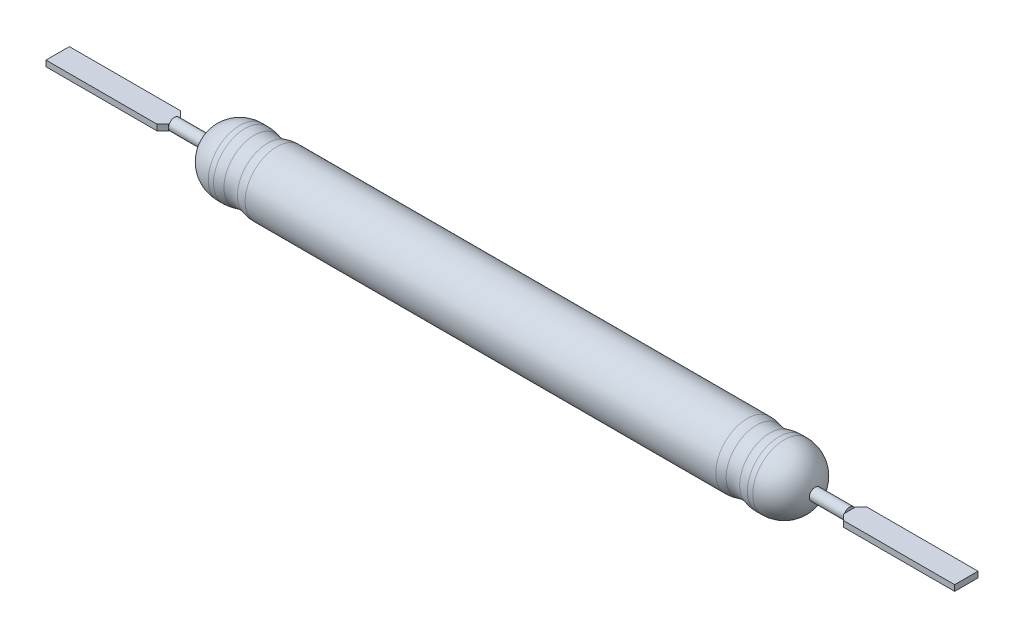
ISO-10303-21;
HEADER;
FILE_DESCRIPTION(('STEP AP214'),'2;1');
FILE_NAME('part.step','',(''),(''),'','','');
FILE_SCHEMA(('AUTOMOTIVE_DESIGN { 1 0 10303 214 1 1 1 1 }'));
ENDSEC;
DATA;
#1=APPLICATION_CONTEXT('core data for automotive mechanical design processes');
#2=APPLICATION_PROTOCOL_DEFINITION('international standard','automotive_design',2000,#1);
#3=PRODUCT_CONTEXT('',#1,'mechanical');
#4=PRODUCT('Part','Part','',(#3));
#5=PRODUCT_RELATED_PRODUCT_CATEGORY('part','',(#4));
#6=PRODUCT_DEFINITION_FORMATION('','',#4);
#7=PRODUCT_DEFINITION_CONTEXT('part definition',#1,'design');
#8=PRODUCT_DEFINITION('design','',#6,#7);
#9=PRODUCT_DEFINITION_SHAPE('','',#8);
#10=(LENGTH_UNIT() NAMED_UNIT(*) SI_UNIT(.MILLI.,.METRE.));
#11=(NAMED_UNIT(*) PLANE_ANGLE_UNIT() SI_UNIT($,.RADIAN.));
#12=(NAMED_UNIT(*) SI_UNIT($,.STERADIAN.) SOLID_ANGLE_UNIT());
#13=UNCERTAINTY_MEASURE_WITH_UNIT(LENGTH_MEASURE(1.E-05),#10,'distance_accuracy_value','');
#14=(GEOMETRIC_REPRESENTATION_CONTEXT(3) GLOBAL_UNCERTAINTY_ASSIGNED_CONTEXT((#13)) GLOBAL_UNIT_ASSIGNED_CONTEXT((#10,
#11,#12)) REPRESENTATION_CONTEXT('',''));
#15=CARTESIAN_POINT('',(0.,0.,0.));
#16=DIRECTION('',(0.,0.,1.));
#17=DIRECTION('',(1.,0.,0.));
#18=AXIS2_PLACEMENT_3D('',#15,#16,#17);
#19=CARTESIAN_POINT('',(54.9,0.,0.));
#20=DIRECTION('',(-1.,0.,0.));
#21=DIRECTION('',(0.,0.,1.));
#22=AXIS2_PLACEMENT_3D('',#19,#20,#21);
#23=PLANE('',#22);
#24=DIRECTION('',(0.,0.,1.));
#25=VECTOR('',#24,1.);
#26=CARTESIAN_POINT('',(54.9,0.25,-0.999999999999994));
#27=LINE('',#26,#25);
#28=CARTESIAN_POINT('',(54.9,0.25,-0.5));
#29=VERTEX_POINT('',#28);
#30=CARTESIAN_POINT('',(54.9,0.25,-0.43301270189222));
#31=VERTEX_POINT('',#30);
#32=EDGE_CURVE('E447',#29,#31,#27,.T.);
#33=ORIENTED_EDGE('',*,*,#32,.F.);
#34=DIRECTION('',(0.,-1.,0.));
#35=VECTOR('',#34,1.);
#36=CARTESIAN_POINT('',(54.9,-0.25,-0.5));
#37=LINE('',#36,#35);
#38=CARTESIAN_POINT('',(54.9,0.,-0.5));
#39=VERTEX_POINT('',#38);
#40=EDGE_CURVE('E11',#29,#39,#37,.T.);
#41=ORIENTED_EDGE('',*,*,#40,.T.);
#42=CARTESIAN_POINT('',(54.9,0.,0.));
#43=DIRECTION('',(1.,0.,0.));
#44=DIRECTION('',(0.,0.,-1.));
#45=AXIS2_PLACEMENT_3D('',#42,#43,#44);
#46=CIRCLE('',#45,0.500000000000006);
#47=EDGE_CURVE('E287',#39,#31,#46,.T.);
#48=ORIENTED_EDGE('',*,*,#47,.T.);
#49=EDGE_LOOP('',(#33,#41,#48));
#50=FACE_BOUND('',#49,.T.);
#51=ADVANCED_FACE('F45',(#50),#23,.T.);
#52=DIRECTION('',(0.,0.,-1.));
#53=VECTOR('',#52,1.);
#54=CARTESIAN_POINT('',(54.9,-0.25,-0.999999999999994));
#55=LINE('',#54,#53);
#56=CARTESIAN_POINT('',(54.9,-0.25,0.499999999999999));
#57=VERTEX_POINT('',#56);
#58=CARTESIAN_POINT('',(54.9,-0.25,0.433012701892233));
#59=VERTEX_POINT('',#58);
#60=EDGE_CURVE('E229',#57,#59,#55,.T.);
#61=ORIENTED_EDGE('',*,*,#60,.F.);
#62=DIRECTION('',(0.,1.,0.));
#63=VECTOR('',#62,1.);
#64=CARTESIAN_POINT('',(54.9,0.25,0.499999999999999));
#65=LINE('',#64,#63);
#66=CARTESIAN_POINT('',(54.9,0.,0.499999999999999));
#67=VERTEX_POINT('',#66);
#68=EDGE_CURVE('E421',#57,#67,#65,.T.);
#69=ORIENTED_EDGE('',*,*,#68,.T.);
#70=EDGE_CURVE('E491',#67,#59,#46,.T.);
#71=ORIENTED_EDGE('',*,*,#70,.T.);
#72=EDGE_LOOP('',(#61,#69,#71));
#73=FACE_BOUND('',#72,.T.);
#74=ADVANCED_FACE('F456',(#73),#23,.T.);
#75=CARTESIAN_POINT('',(54.9,0.,0.));
#76=DIRECTION('',(1.,0.,0.));
#77=DIRECTION('',(0.,0.,-1.));
#78=AXIS2_PLACEMENT_3D('',#75,#76,#77);
#79=PLANE('',#78);
#80=CARTESIAN_POINT('',(54.9,-0.25,-0.43301270189222));
#81=VERTEX_POINT('',#80);
#82=EDGE_CURVE('E412',#59,#81,#55,.T.);
#83=ORIENTED_EDGE('',*,*,#82,.F.);
#84=EDGE_CURVE('E492',#59,#81,#46,.T.);
#85=ORIENTED_EDGE('',*,*,#84,.T.);
#86=EDGE_LOOP('',(#83,#85));
#87=FACE_BOUND('',#86,.T.);
#88=ADVANCED_FACE('F461',(#87),#79,.T.);
#89=CARTESIAN_POINT('',(-2.90000000000002,0.,0.));
#90=DIRECTION('',(-1.,0.,0.));
#91=DIRECTION('',(0.,0.,1.));
#92=AXIS2_PLACEMENT_3D('',#89,#90,#91);
#93=PLANE('',#92);
#94=DIRECTION('',(0.,0.,1.));
#95=VECTOR('',#94,1.);
#96=CARTESIAN_POINT('',(-2.90000000000002,-0.25,-1.));
#97=LINE('',#96,#95);
#98=CARTESIAN_POINT('',(-2.90000000000002,-0.25,-0.499999999999993));
#99=VERTEX_POINT('',#98);
#100=CARTESIAN_POINT('',(-2.90000000000002,-0.25,-0.433012701892227));
#101=VERTEX_POINT('',#100);
#102=EDGE_CURVE('E239',#99,#101,#97,.T.);
#103=ORIENTED_EDGE('',*,*,#102,.F.);
#104=DIRECTION('',(0.,1.,0.));
#105=VECTOR('',#104,1.);
#106=CARTESIAN_POINT('',(-2.90000000000002,0.,-0.499999999999993));
#107=LINE('',#106,#105);
#108=CARTESIAN_POINT('',(-2.90000000000002,0.,-0.499999999999993));
#109=VERTEX_POINT('',#108);
#110=EDGE_CURVE('E403',#99,#109,#107,.T.);
#111=ORIENTED_EDGE('',*,*,#110,.T.);
#112=CARTESIAN_POINT('',(-2.90000000000002,0.,0.));
#113=DIRECTION('',(1.,0.,0.));
#114=DIRECTION('',(0.,0.,-1.));
#115=AXIS2_PLACEMENT_3D('',#112,#113,#114);
#116=CIRCLE('',#115,0.500000000000006);
#117=EDGE_CURVE('E677',#101,#109,#116,.T.);
#118=ORIENTED_EDGE('',*,*,#117,.F.);
#119=EDGE_LOOP('',(#103,#111,#118));
#120=FACE_BOUND('',#119,.T.);
#121=ADVANCED_FACE('F602',(#120),#93,.F.);
#122=DIRECTION('',(0.,0.,-1.));
#123=VECTOR('',#122,1.);
#124=CARTESIAN_POINT('',(-2.90000000000002,0.25,-1.));
#125=LINE('',#124,#123);
#126=CARTESIAN_POINT('',(-2.90000000000002,0.25,0.500000000000006));
#127=VERTEX_POINT('',#126);
#128=CARTESIAN_POINT('',(-2.90000000000002,0.25,0.433012701892226));
#129=VERTEX_POINT('',#128);
#130=EDGE_CURVE('E251',#127,#129,#125,.T.);
#131=ORIENTED_EDGE('',*,*,#130,.F.);
#132=DIRECTION('',(0.,-1.,0.));
#133=VECTOR('',#132,1.);
#134=CARTESIAN_POINT('',(-2.90000000000002,0.,0.500000000000006));
#135=LINE('',#134,#133);
#136=CARTESIAN_POINT('',(-2.90000000000002,0.,0.500000000000006));
#137=VERTEX_POINT('',#136);
#138=EDGE_CURVE('E387',#127,#137,#135,.T.);
#139=ORIENTED_EDGE('',*,*,#138,.T.);
#140=EDGE_CURVE('E292',#129,#137,#116,.T.);
#141=ORIENTED_EDGE('',*,*,#140,.F.);
#142=EDGE_LOOP('',(#131,#139,#141));
#143=FACE_BOUND('',#142,.T.);
#144=ADVANCED_FACE('F660',(#143),#93,.F.);
#145=CARTESIAN_POINT('',(-2.90000000000002,0.,0.));
#146=DIRECTION('',(1.,0.,0.));
#147=DIRECTION('',(0.,0.,-1.));
#148=AXIS2_PLACEMENT_3D('',#145,#146,#147);
#149=PLANE('',#148);
#150=CARTESIAN_POINT('',(-2.90000000000002,0.25,-0.433012701892227));
#151=VERTEX_POINT('',#150);
#152=EDGE_CURVE('E265',#129,#151,#125,.T.);
#153=ORIENTED_EDGE('',*,*,#152,.F.);
#154=EDGE_CURVE('E288',#151,#129,#116,.T.);
#155=ORIENTED_EDGE('',*,*,#154,.F.);
#156=EDGE_LOOP('',(#153,#155));
#157=FACE_BOUND('',#156,.T.);
#158=ADVANCED_FACE('F537',(#157),#149,.F.);
#159=CARTESIAN_POINT('',(-2.90000000000002,-0.25,0.433012701892226));
#160=VERTEX_POINT('',#159);
#161=EDGE_CURVE('E241',#101,#160,#97,.T.);
#162=ORIENTED_EDGE('',*,*,#161,.F.);
#163=EDGE_CURVE('E680',#160,#101,#116,.T.);
#164=ORIENTED_EDGE('',*,*,#163,.F.);
#165=EDGE_LOOP('',(#162,#164));
#166=FACE_BOUND('',#165,.T.);
#167=ADVANCED_FACE('F580',(#166),#149,.F.);
#168=CARTESIAN_POINT('',(2.69,0.,0.));
#169=DIRECTION('',(1.,0.,0.));
#170=DIRECTION('',(0.,0.,-1.));
#171=AXIS2_PLACEMENT_3D('',#168,#169,#170);
#172=DEGENERATE_TOROIDAL_SURFACE('',#171,0.0100000000000005,2.69,.T.);
#173=CARTESIAN_POINT('',(2.69,0.,-0.0100000000000005));
#174=DIRECTION('',(0.,1.,0.));
#175=DIRECTION('',(0.,0.,1.));
#176=AXIS2_PLACEMENT_3D('',#173,#174,#175);
#177=CIRCLE('',#176,2.69);
#178=CARTESIAN_POINT('',(2.69000000000002,0.,-2.7));
#179=VERTEX_POINT('',#178);
#180=CARTESIAN_POINT('',(0.0450047259021435,0.,-0.500000000000006));
#181=VERTEX_POINT('',#180);
#182=EDGE_CURVE('E306',#179,#181,#177,.T.);
#183=ORIENTED_EDGE('',*,*,#182,.T.);
#184=CARTESIAN_POINT('',(0.0450047259021435,0.,0.));
#185=DIRECTION('',(1.,0.,0.));
#186=DIRECTION('',(0.,0.,-1.));
#187=AXIS2_PLACEMENT_3D('',#184,#185,#186);
#188=CIRCLE('',#187,0.500000000000006);
#189=EDGE_CURVE('E293',#181,#181,#188,.T.);
#190=ORIENTED_EDGE('',*,*,#189,.T.);
#191=ORIENTED_EDGE('',*,*,#182,.F.);
#192=CARTESIAN_POINT('',(2.69000000000002,0.,0.));
#193=DIRECTION('',(1.,0.,0.));
#194=DIRECTION('',(0.,0.,-1.));
#195=AXIS2_PLACEMENT_3D('',#192,#193,#194);
#196=CIRCLE('',#195,2.7);
#197=EDGE_CURVE('E362',#179,#179,#196,.T.);
#198=ORIENTED_EDGE('',*,*,#197,.F.);
#199=EDGE_LOOP('',(#183,#190,#191,#198));
#200=FACE_BOUND('',#199,.T.);
#201=ADVANCED_FACE('F542',(#200),#172,.T.);
#202=CARTESIAN_POINT('',(49.31,0.,0.));
#203=DIRECTION('',(1.,0.,0.));
#204=DIRECTION('',(0.,0.,-1.));
#205=AXIS2_PLACEMENT_3D('',#202,#203,#204);
#206=DEGENERATE_TOROIDAL_SURFACE('',#205,0.0100000000000005,2.69,.T.);
#207=CARTESIAN_POINT('',(49.31,0.,-0.0100000000000005));
#208=DIRECTION('',(0.,1.,0.));
#209=DIRECTION('',(0.,0.,-1.));
#210=AXIS2_PLACEMENT_3D('',#207,#208,#209);
#211=CIRCLE('',#210,2.69);
#212=CARTESIAN_POINT('',(51.9549952740979,0.,-0.500000000000013));
#213=VERTEX_POINT('',#212);
#214=CARTESIAN_POINT('',(49.31,0.,-2.7));
#215=VERTEX_POINT('',#214);
#216=EDGE_CURVE('E297',#213,#215,#211,.T.);
#217=ORIENTED_EDGE('',*,*,#216,.F.);
#218=CARTESIAN_POINT('',(51.9549952740979,0.,0.));
#219=DIRECTION('',(-1.,0.,0.));
#220=DIRECTION('',(0.,0.,1.));
#221=AXIS2_PLACEMENT_3D('',#218,#219,#220);
#222=CIRCLE('',#221,0.500000000000006);
#223=EDGE_CURVE('E285',#213,#213,#222,.T.);
#224=ORIENTED_EDGE('',*,*,#223,.T.);
#225=ORIENTED_EDGE('',*,*,#216,.T.);
#226=CARTESIAN_POINT('',(49.31,0.,0.));
#227=DIRECTION('',(1.,0.,0.));
#228=DIRECTION('',(0.,0.,-1.));
#229=AXIS2_PLACEMENT_3D('',#226,#227,#228);
#230=CIRCLE('',#229,2.7);
#231=EDGE_CURVE('E301',#215,#215,#230,.T.);
#232=ORIENTED_EDGE('',*,*,#231,.T.);
#233=EDGE_LOOP('',(#217,#224,#225,#232));
#234=FACE_BOUND('',#233,.T.);
#235=ADVANCED_FACE('F538',(#234),#206,.T.);
#236=CARTESIAN_POINT('',(0.,0.,0.));
#237=DIRECTION('',(1.,0.,0.));
#238=DIRECTION('',(0.,0.,-1.));
#239=AXIS2_PLACEMENT_3D('',#236,#237,#238);
#240=CYLINDRICAL_SURFACE('',#239,2.7);
#241=DIRECTION('',(-1.,0.,0.));
#242=VECTOR('',#241,1.);
#243=CARTESIAN_POINT('',(2.69000000000002,0.,-2.7));
#244=LINE('',#243,#242);
#245=CARTESIAN_POINT('',(3.14500922512365,0.,-2.7));
#246=VERTEX_POINT('',#245);
#247=EDGE_CURVE('E359',#246,#179,#244,.T.);
#248=ORIENTED_EDGE('',*,*,#247,.F.);
#249=CARTESIAN_POINT('',(3.14500922512365,0.,0.));
#250=DIRECTION('',(1.,0.,0.));
#251=DIRECTION('',(0.,0.,-1.));
#252=AXIS2_PLACEMENT_3D('',#249,#250,#251);
#253=CIRCLE('',#252,2.7);
#254=EDGE_CURVE('E355',#246,#246,#253,.T.);
#255=ORIENTED_EDGE('',*,*,#254,.F.);
#256=ORIENTED_EDGE('',*,*,#247,.T.);
#257=ORIENTED_EDGE('',*,*,#197,.T.);
#258=EDGE_LOOP('',(#248,#255,#256,#257));
#259=FACE_BOUND('',#258,.T.);
#260=ADVANCED_FACE('F541',(#259),#240,.T.);
#261=CARTESIAN_POINT('',(3.14500922512365,0.,0.));
#262=DIRECTION('',(1.,0.,0.));
#263=DIRECTION('',(0.,0.,-1.));
#264=AXIS2_PLACEMENT_3D('',#261,#262,#263);
#265=DEGENERATE_TOROIDAL_SURFACE('',#264,0.01,2.69,.T.);
#266=CARTESIAN_POINT('',(3.14500922512365,0.,-0.01));
#267=DIRECTION('',(0.,1.,0.));
#268=DIRECTION('',(0.,0.,1.));
#269=AXIS2_PLACEMENT_3D('',#266,#267,#268);
#270=CIRCLE('',#269,2.69);
#271=CARTESIAN_POINT('',(3.92217877403994,0.,-2.58528784648188));
#272=VERTEX_POINT('',#271);
#273=EDGE_CURVE('E352',#272,#246,#270,.T.);
#274=ORIENTED_EDGE('',*,*,#273,.F.);
#275=CARTESIAN_POINT('',(3.92217877403994,0.,0.));
#276=DIRECTION('',(1.,0.,0.));
#277=DIRECTION('',(0.,0.,-1.));
#278=AXIS2_PLACEMENT_3D('',#275,#276,#277);
#279=CIRCLE('',#278,2.58528784648188);
#280=EDGE_CURVE('E348',#272,#272,#279,.T.);
#281=ORIENTED_EDGE('',*,*,#280,.F.);
#282=ORIENTED_EDGE('',*,*,#273,.T.);
#283=ORIENTED_EDGE('',*,*,#254,.T.);
#284=EDGE_LOOP('',(#274,#281,#282,#283));
#285=FACE_BOUND('',#284,.T.);
#286=ADVANCED_FACE('F570',(#285),#265,.T.);
#287=CARTESIAN_POINT('',(4.5,0.,0.));
#288=DIRECTION('',(1.,0.,0.));
#289=DIRECTION('',(0.,0.,-1.));
#290=AXIS2_PLACEMENT_3D('',#287,#288,#289);
#291=TOROIDAL_SURFACE('',#290,4.5,2.);
#292=CARTESIAN_POINT('',(4.5,0.,-4.5));
#293=DIRECTION('',(0.,-1.,0.));
#294=DIRECTION('',(0.,0.,1.));
#295=AXIS2_PLACEMENT_3D('',#292,#293,#294);
#296=CIRCLE('',#295,2.);
#297=CARTESIAN_POINT('',(5.07782122596006,0.,-2.58528784648188));
#298=VERTEX_POINT('',#297);
#299=EDGE_CURVE('E345',#298,#272,#296,.T.);
#300=ORIENTED_EDGE('',*,*,#299,.F.);
#301=CARTESIAN_POINT('',(5.07782122596006,0.,0.));
#302=DIRECTION('',(1.,0.,0.));
#303=DIRECTION('',(0.,0.,-1.));
#304=AXIS2_PLACEMENT_3D('',#301,#302,#303);
#305=CIRCLE('',#304,2.58528784648188);
#306=EDGE_CURVE('E341',#298,#298,#305,.T.);
#307=ORIENTED_EDGE('',*,*,#306,.F.);
#308=ORIENTED_EDGE('',*,*,#299,.T.);
#309=ORIENTED_EDGE('',*,*,#280,.T.);
#310=EDGE_LOOP('',(#300,#307,#308,#309));
#311=FACE_BOUND('',#310,.T.);
#312=ADVANCED_FACE('F566',(#311),#291,.F.);
#313=CARTESIAN_POINT('',(5.85499077487635,0.,0.));
#314=DIRECTION('',(1.,0.,0.));
#315=DIRECTION('',(0.,0.,-1.));
#316=AXIS2_PLACEMENT_3D('',#313,#314,#315);
#317=DEGENERATE_TOROIDAL_SURFACE('',#316,0.0100000000000005,2.69,.T.);
#318=CARTESIAN_POINT('',(5.85499077487635,0.,-0.0100000000000005));
#319=DIRECTION('',(0.,1.,0.));
#320=DIRECTION('',(0.,0.,1.));
#321=AXIS2_PLACEMENT_3D('',#318,#319,#320);
#322=CIRCLE('',#321,2.69);
#323=CARTESIAN_POINT('',(5.85499077487635,0.,-2.7));
#324=VERTEX_POINT('',#323);
#325=EDGE_CURVE('E338',#324,#298,#322,.T.);
#326=ORIENTED_EDGE('',*,*,#325,.F.);
#327=CARTESIAN_POINT('',(5.85499077487635,0.,0.));
#328=DIRECTION('',(1.,0.,0.));
#329=DIRECTION('',(0.,0.,-1.));
#330=AXIS2_PLACEMENT_3D('',#327,#328,#329);
#331=CIRCLE('',#330,2.7);
#332=EDGE_CURVE('E334',#324,#324,#331,.T.);
#333=ORIENTED_EDGE('',*,*,#332,.F.);
#334=ORIENTED_EDGE('',*,*,#325,.T.);
#335=ORIENTED_EDGE('',*,*,#306,.T.);
#336=EDGE_LOOP('',(#326,#333,#334,#335));
#337=FACE_BOUND('',#336,.T.);
#338=ADVANCED_FACE('F562',(#337),#317,.T.);
#339=CARTESIAN_POINT('',(0.,0.,0.));
#340=DIRECTION('',(1.,0.,0.));
#341=DIRECTION('',(0.,0.,-1.));
#342=AXIS2_PLACEMENT_3D('',#339,#340,#341);
#343=CYLINDRICAL_SURFACE('',#342,2.7);
#344=DIRECTION('',(-1.,0.,0.));
#345=VECTOR('',#344,1.);
#346=CARTESIAN_POINT('',(5.85499077487635,0.,-2.7));
#347=LINE('',#346,#345);
#348=CARTESIAN_POINT('',(46.1450092251236,0.,-2.7));
#349=VERTEX_POINT('',#348);
#350=EDGE_CURVE('E331',#349,#324,#347,.T.);
#351=ORIENTED_EDGE('',*,*,#350,.F.);
#352=CARTESIAN_POINT('',(46.1450092251236,0.,0.));
#353=DIRECTION('',(1.,0.,0.));
#354=DIRECTION('',(0.,0.,-1.));
#355=AXIS2_PLACEMENT_3D('',#352,#353,#354);
#356=CIRCLE('',#355,2.7);
#357=EDGE_CURVE('E327',#349,#349,#356,.T.);
#358=ORIENTED_EDGE('',*,*,#357,.F.);
#359=ORIENTED_EDGE('',*,*,#350,.T.);
#360=ORIENTED_EDGE('',*,*,#332,.T.);
#361=EDGE_LOOP('',(#351,#358,#359,#360));
#362=FACE_BOUND('',#361,.T.);
#363=ADVANCED_FACE('F558',(#362),#343,.T.);
#364=CARTESIAN_POINT('',(46.1450092251236,0.,0.));
#365=DIRECTION('',(1.,0.,0.));
#366=DIRECTION('',(0.,0.,-1.));
#367=AXIS2_PLACEMENT_3D('',#364,#365,#366);
#368=DEGENERATE_TOROIDAL_SURFACE('',#367,0.0100000000000005,2.69,.T.);
#369=CARTESIAN_POINT('',(46.1450092251236,0.,-0.0100000000000005));
#370=DIRECTION('',(0.,1.,0.));
#371=DIRECTION('',(0.,0.,1.));
#372=AXIS2_PLACEMENT_3D('',#369,#370,#371);
#373=CIRCLE('',#372,2.69);
#374=CARTESIAN_POINT('',(46.9221787740399,0.,-2.58528784648188));
#375=VERTEX_POINT('',#374);
#376=EDGE_CURVE('E324',#375,#349,#373,.T.);
#377=ORIENTED_EDGE('',*,*,#376,.F.);
#378=CARTESIAN_POINT('',(46.9221787740399,0.,0.));
#379=DIRECTION('',(1.,0.,0.));
#380=DIRECTION('',(0.,0.,-1.));
#381=AXIS2_PLACEMENT_3D('',#378,#379,#380);
#382=CIRCLE('',#381,2.58528784648188);
#383=EDGE_CURVE('E320',#375,#375,#382,.T.);
#384=ORIENTED_EDGE('',*,*,#383,.F.);
#385=ORIENTED_EDGE('',*,*,#376,.T.);
#386=ORIENTED_EDGE('',*,*,#357,.T.);
#387=EDGE_LOOP('',(#377,#384,#385,#386));
#388=FACE_BOUND('',#387,.T.);
#389=ADVANCED_FACE('F554',(#388),#368,.T.);
#390=CARTESIAN_POINT('',(47.5,0.,0.));
#391=DIRECTION('',(1.,0.,0.));
#392=DIRECTION('',(0.,0.,-1.));
#393=AXIS2_PLACEMENT_3D('',#390,#391,#392);
#394=TOROIDAL_SURFACE('',#393,4.5,2.);
#395=CARTESIAN_POINT('',(47.5,0.,-4.5));
#396=DIRECTION('',(0.,-1.,0.));
#397=DIRECTION('',(0.,0.,-1.));
#398=AXIS2_PLACEMENT_3D('',#395,#396,#397);
#399=CIRCLE('',#398,2.);
#400=CARTESIAN_POINT('',(48.07782122596,0.,-2.58528784648188));
#401=VERTEX_POINT('',#400);
#402=EDGE_CURVE('E317',#401,#375,#399,.T.);
#403=ORIENTED_EDGE('',*,*,#402,.F.);
#404=CARTESIAN_POINT('',(48.07782122596,0.,0.));
#405=DIRECTION('',(1.,0.,0.));
#406=DIRECTION('',(0.,0.,-1.));
#407=AXIS2_PLACEMENT_3D('',#404,#405,#406);
#408=CIRCLE('',#407,2.58528784648188);
#409=EDGE_CURVE('E313',#401,#401,#408,.T.);
#410=ORIENTED_EDGE('',*,*,#409,.F.);
#411=ORIENTED_EDGE('',*,*,#402,.T.);
#412=ORIENTED_EDGE('',*,*,#383,.T.);
#413=EDGE_LOOP('',(#403,#410,#411,#412));
#414=FACE_BOUND('',#413,.T.);
#415=ADVANCED_FACE('F550',(#414),#394,.F.);
#416=CARTESIAN_POINT('',(48.8549907748763,0.,0.));
#417=DIRECTION('',(1.,0.,0.));
#418=DIRECTION('',(0.,0.,-1.));
#419=AXIS2_PLACEMENT_3D('',#416,#417,#418);
#420=DEGENERATE_TOROIDAL_SURFACE('',#419,0.0100000000000005,2.69,.T.);
#421=CARTESIAN_POINT('',(48.8549907748763,0.,-0.0100000000000005));
#422=DIRECTION('',(0.,1.,0.));
#423=DIRECTION('',(0.,0.,1.));
#424=AXIS2_PLACEMENT_3D('',#421,#422,#423);
#425=CIRCLE('',#424,2.69);
#426=CARTESIAN_POINT('',(48.8549907748763,0.,-2.7));
#427=VERTEX_POINT('',#426);
#428=EDGE_CURVE('E310',#427,#401,#425,.T.);
#429=ORIENTED_EDGE('',*,*,#428,.F.);
#430=CARTESIAN_POINT('',(48.8549907748763,0.,0.));
#431=DIRECTION('',(1.,0.,0.));
#432=DIRECTION('',(0.,0.,-1.));
#433=AXIS2_PLACEMENT_3D('',#430,#431,#432);
#434=CIRCLE('',#433,2.7);
#435=EDGE_CURVE('E305',#427,#427,#434,.T.);
#436=ORIENTED_EDGE('',*,*,#435,.F.);
#437=ORIENTED_EDGE('',*,*,#428,.T.);
#438=ORIENTED_EDGE('',*,*,#409,.T.);
#439=EDGE_LOOP('',(#429,#436,#437,#438));
#440=FACE_BOUND('',#439,.T.);
#441=ADVANCED_FACE('F546',(#440),#420,.T.);
#442=CARTESIAN_POINT('',(0.,0.,0.));
#443=DIRECTION('',(1.,0.,0.));
#444=DIRECTION('',(0.,0.,-1.));
#445=AXIS2_PLACEMENT_3D('',#442,#443,#444);
#446=CYLINDRICAL_SURFACE('',#445,2.7);
#447=DIRECTION('',(-1.,0.,0.));
#448=VECTOR('',#447,1.);
#449=CARTESIAN_POINT('',(48.8549907748763,0.,-2.7));
#450=LINE('',#449,#448);
#451=EDGE_CURVE('E300',#215,#427,#450,.T.);
#452=ORIENTED_EDGE('',*,*,#451,.F.);
#453=ORIENTED_EDGE('',*,*,#231,.F.);
#454=ORIENTED_EDGE('',*,*,#451,.T.);
#455=ORIENTED_EDGE('',*,*,#435,.T.);
#456=EDGE_LOOP('',(#452,#453,#454,#455));
#457=FACE_BOUND('',#456,.T.);
#458=ADVANCED_FACE('F533',(#457),#446,.T.);
#459=CARTESIAN_POINT('',(54.9,0.25,0.433012701892233));
#460=VERTEX_POINT('',#459);
#461=EDGE_CURVE('E406',#31,#460,#27,.T.);
#462=ORIENTED_EDGE('',*,*,#461,.F.);
#463=EDGE_CURVE('E282',#31,#460,#46,.T.);
#464=ORIENTED_EDGE('',*,*,#463,.T.);
#465=EDGE_LOOP('',(#462,#464));
#466=FACE_BOUND('',#465,.T.);
#467=ADVANCED_FACE('F520',(#466),#79,.T.);
#468=CARTESIAN_POINT('',(54.9,0.,0.));
#469=DIRECTION('',(-1.,0.,0.));
#470=DIRECTION('',(0.,0.,1.));
#471=AXIS2_PLACEMENT_3D('',#468,#469,#470);
#472=CYLINDRICAL_SURFACE('',#471,0.500000000000006);
#473=ORIENTED_EDGE('',*,*,#223,.F.);
#474=EDGE_LOOP('',(#473));
#475=FACE_BOUND('',#474,.T.);
#476=ORIENTED_EDGE('',*,*,#463,.F.);
#477=ORIENTED_EDGE('',*,*,#47,.F.);
#478=EDGE_CURVE('E439',#81,#39,#46,.T.);
#479=ORIENTED_EDGE('',*,*,#478,.F.);
#480=ORIENTED_EDGE('',*,*,#84,.F.);
#481=ORIENTED_EDGE('',*,*,#70,.F.);
#482=EDGE_CURVE('E286',#460,#67,#46,.T.);
#483=ORIENTED_EDGE('',*,*,#482,.F.);
#484=EDGE_LOOP('',(#476,#477,#479,#480,#481,#483));
#485=FACE_BOUND('',#484,.T.);
#486=ADVANCED_FACE('F522',(#475,#485),#472,.T.);
#487=ORIENTED_EDGE('',*,*,#189,.F.);
#488=EDGE_LOOP('',(#487));
#489=FACE_BOUND('',#488,.T.);
#490=ORIENTED_EDGE('',*,*,#154,.T.);
#491=ORIENTED_EDGE('',*,*,#140,.T.);
#492=EDGE_CURVE('E611',#137,#160,#116,.T.);
#493=ORIENTED_EDGE('',*,*,#492,.T.);
#494=ORIENTED_EDGE('',*,*,#163,.T.);
#495=ORIENTED_EDGE('',*,*,#117,.T.);
#496=EDGE_CURVE('E281',#109,#151,#116,.T.);
#497=ORIENTED_EDGE('',*,*,#496,.T.);
#498=EDGE_LOOP('',(#490,#491,#493,#494,#495,#497));
#499=FACE_BOUND('',#498,.T.);
#500=ADVANCED_FACE('F524',(#489,#499),#472,.T.);
#501=ORIENTED_EDGE('',*,*,#492,.F.);
#502=DIRECTION('',(0.,-1.,0.));
#503=VECTOR('',#502,1.);
#504=CARTESIAN_POINT('',(-2.90000000000002,0.,0.500000000000006));
#505=LINE('',#504,#503);
#506=CARTESIAN_POINT('',(-2.90000000000002,-0.25,0.500000000000006));
#507=VERTEX_POINT('',#506);
#508=EDGE_CURVE('E384',#137,#507,#505,.T.);
#509=ORIENTED_EDGE('',*,*,#508,.T.);
#510=EDGE_CURVE('E234',#160,#507,#97,.T.);
#511=ORIENTED_EDGE('',*,*,#510,.F.);
#512=EDGE_LOOP('',(#501,#509,#511));
#513=FACE_BOUND('',#512,.T.);
#514=ADVANCED_FACE('F531',(#513),#93,.F.);
#515=CARTESIAN_POINT('',(-12.9,0.25,-1.));
#516=DIRECTION('',(0.,0.,1.));
#517=DIRECTION('',(1.,0.,0.));
#518=AXIS2_PLACEMENT_3D('',#515,#516,#517);
#519=PLANE('',#518);
#520=DIRECTION('',(1.,0.,0.));
#521=VECTOR('',#520,1.);
#522=CARTESIAN_POINT('',(-12.9,0.25,-1.));
#523=LINE('',#522,#521);
#524=CARTESIAN_POINT('',(-12.9,0.25,-1.));
#525=VERTEX_POINT('',#524);
#526=CARTESIAN_POINT('',(-3.40000000000003,0.25,-1.));
#527=VERTEX_POINT('',#526);
#528=EDGE_CURVE('E259',#525,#527,#523,.T.);
#529=ORIENTED_EDGE('',*,*,#528,.T.);
#530=DIRECTION('',(0.,-1.,0.));
#531=VECTOR('',#530,1.);
#532=CARTESIAN_POINT('',(-3.40000000000003,0.25,-1.));
#533=LINE('',#532,#531);
#534=CARTESIAN_POINT('',(-3.40000000000003,-0.25,-1.));
#535=VERTEX_POINT('',#534);
#536=EDGE_CURVE('E396',#527,#535,#533,.T.);
#537=ORIENTED_EDGE('',*,*,#536,.T.);
#538=DIRECTION('',(1.,0.,0.));
#539=VECTOR('',#538,1.);
#540=CARTESIAN_POINT('',(-12.9,-0.25,-1.));
#541=LINE('',#540,#539);
#542=CARTESIAN_POINT('',(-12.9,-0.25,-1.));
#543=VERTEX_POINT('',#542);
#544=EDGE_CURVE('E277',#543,#535,#541,.T.);
#545=ORIENTED_EDGE('',*,*,#544,.F.);
#546=DIRECTION('',(0.,-1.,0.));
#547=VECTOR('',#546,1.);
#548=CARTESIAN_POINT('',(-12.9,0.25,-1.));
#549=LINE('',#548,#547);
#550=EDGE_CURVE('E246',#525,#543,#549,.T.);
#551=ORIENTED_EDGE('',*,*,#550,.F.);
#552=EDGE_LOOP('',(#529,#537,#545,#551));
#553=FACE_BOUND('',#552,.T.);
#554=ADVANCED_FACE('F638',(#553),#519,.F.);
#555=CARTESIAN_POINT('',(-12.9,-0.25,-1.));
#556=DIRECTION('',(0.,1.,0.));
#557=DIRECTION('',(0.,0.,1.));
#558=AXIS2_PLACEMENT_3D('',#555,#556,#557);
#559=PLANE('',#558);
#560=ORIENTED_EDGE('',*,*,#510,.T.);
#561=DIRECTION('',(0.707106781186548,0.,-0.707106781186547));
#562=VECTOR('',#561,1.);
#563=CARTESIAN_POINT('',(-3.40000000000001,-0.25,0.999999999999999));
#564=LINE('',#563,#562);
#565=CARTESIAN_POINT('',(-3.40000000000001,-0.25,0.999999999999999));
#566=VERTEX_POINT('',#565);
#567=EDGE_CURVE('E393',#507,#566,#564,.F.);
#568=ORIENTED_EDGE('',*,*,#567,.T.);
#569=DIRECTION('',(1.,0.,0.));
#570=VECTOR('',#569,1.);
#571=CARTESIAN_POINT('',(-12.9,-0.25,0.999999999999998));
#572=LINE('',#571,#570);
#573=CARTESIAN_POINT('',(-12.9,-0.25,0.999999999999998));
#574=VERTEX_POINT('',#573);
#575=EDGE_CURVE('E273',#574,#566,#572,.T.);
#576=ORIENTED_EDGE('',*,*,#575,.F.);
#577=DIRECTION('',(0.,0.,1.));
#578=VECTOR('',#577,1.);
#579=CARTESIAN_POINT('',(-12.9,-0.25,-1.));
#580=LINE('',#579,#578);
#581=EDGE_CURVE('E250',#543,#574,#580,.T.);
#582=ORIENTED_EDGE('',*,*,#581,.F.);
#583=ORIENTED_EDGE('',*,*,#544,.T.);
#584=DIRECTION('',(-0.707106781186547,0.,-0.707106781186548));
#585=VECTOR('',#584,1.);
#586=CARTESIAN_POINT('',(-3.40000000000003,-0.25,-1.));
#587=LINE('',#586,#585);
#588=EDGE_CURVE('E390',#535,#99,#587,.F.);
#589=ORIENTED_EDGE('',*,*,#588,.T.);
#590=ORIENTED_EDGE('',*,*,#102,.T.);
#591=ORIENTED_EDGE('',*,*,#161,.T.);
#592=EDGE_LOOP('',(#560,#568,#576,#582,#583,#589,#590,#591));
#593=FACE_BOUND('',#592,.T.);
#594=ADVANCED_FACE('F614',(#593),#559,.F.);
#595=CARTESIAN_POINT('',(-12.9,0.25,0.999999999999998));
#596=DIRECTION('',(0.,0.,-1.));
#597=DIRECTION('',(-1.,0.,0.));
#598=AXIS2_PLACEMENT_3D('',#595,#596,#597);
#599=PLANE('',#598);
#600=ORIENTED_EDGE('',*,*,#575,.T.);
#601=DIRECTION('',(0.,1.,0.));
#602=VECTOR('',#601,1.);
#603=CARTESIAN_POINT('',(-3.40000000000001,0.25,0.999999999999999));
#604=LINE('',#603,#602);
#605=CARTESIAN_POINT('',(-3.40000000000001,0.25,0.999999999999999));
#606=VERTEX_POINT('',#605);
#607=EDGE_CURVE('E374',#566,#606,#604,.T.);
#608=ORIENTED_EDGE('',*,*,#607,.T.);
#609=DIRECTION('',(1.,0.,0.));
#610=VECTOR('',#609,1.);
#611=CARTESIAN_POINT('',(-12.9,0.25,0.999999999999998));
#612=LINE('',#611,#610);
#613=CARTESIAN_POINT('',(-12.9,0.25,0.999999999999998));
#614=VERTEX_POINT('',#613);
#615=EDGE_CURVE('E269',#614,#606,#612,.T.);
#616=ORIENTED_EDGE('',*,*,#615,.F.);
#617=DIRECTION('',(0.,1.,0.));
#618=VECTOR('',#617,1.);
#619=CARTESIAN_POINT('',(-12.9,0.25,0.999999999999998));
#620=LINE('',#619,#618);
#621=EDGE_CURVE('E254',#574,#614,#620,.T.);
#622=ORIENTED_EDGE('',*,*,#621,.F.);
#623=EDGE_LOOP('',(#600,#608,#616,#622));
#624=FACE_BOUND('',#623,.T.);
#625=ADVANCED_FACE('F646',(#624),#599,.F.);
#626=CARTESIAN_POINT('',(-12.9,0.25,-1.));
#627=DIRECTION('',(0.,-1.,0.));
#628=DIRECTION('',(0.,0.,-1.));
#629=AXIS2_PLACEMENT_3D('',#626,#627,#628);
#630=PLANE('',#629);
#631=ORIENTED_EDGE('',*,*,#615,.T.);
#632=DIRECTION('',(-0.707106781186548,0.,0.707106781186547));
#633=VECTOR('',#632,1.);
#634=CARTESIAN_POINT('',(-3.40000000000001,0.25,0.999999999999999));
#635=LINE('',#634,#633);
#636=EDGE_CURVE('E381',#606,#127,#635,.F.);
#637=ORIENTED_EDGE('',*,*,#636,.T.);
#638=ORIENTED_EDGE('',*,*,#130,.T.);
#639=ORIENTED_EDGE('',*,*,#152,.T.);
#640=CARTESIAN_POINT('',(-2.90000000000002,0.25,-0.499999999999993));
#641=VERTEX_POINT('',#640);
#642=EDGE_CURVE('E262',#151,#641,#125,.T.);
#643=ORIENTED_EDGE('',*,*,#642,.T.);
#644=DIRECTION('',(0.707106781186547,0.,0.707106781186548));
#645=VECTOR('',#644,1.);
#646=CARTESIAN_POINT('',(-3.40000000000003,0.25,-1.));
#647=LINE('',#646,#645);
#648=EDGE_CURVE('E378',#641,#527,#647,.F.);
#649=ORIENTED_EDGE('',*,*,#648,.T.);
#650=ORIENTED_EDGE('',*,*,#528,.F.);
#651=DIRECTION('',(0.,0.,-1.));
#652=VECTOR('',#651,1.);
#653=CARTESIAN_POINT('',(-12.9,0.25,-1.));
#654=LINE('',#653,#652);
#655=EDGE_CURVE('E257',#614,#525,#654,.T.);
#656=ORIENTED_EDGE('',*,*,#655,.F.);
#657=EDGE_LOOP('',(#631,#637,#638,#639,#643,#649,#650,#656));
#658=FACE_BOUND('',#657,.T.);
#659=ADVANCED_FACE('F630',(#658),#630,.F.);
#660=CARTESIAN_POINT('',(-12.9,0.,0.));
#661=DIRECTION('',(-1.,0.,0.));
#662=DIRECTION('',(0.,0.,1.));
#663=AXIS2_PLACEMENT_3D('',#660,#661,#662);
#664=PLANE('',#663);
#665=ORIENTED_EDGE('',*,*,#550,.T.);
#666=ORIENTED_EDGE('',*,*,#581,.T.);
#667=ORIENTED_EDGE('',*,*,#621,.T.);
#668=ORIENTED_EDGE('',*,*,#655,.T.);
#669=EDGE_LOOP('',(#665,#666,#667,#668));
#670=FACE_BOUND('',#669,.T.);
#671=ADVANCED_FACE('F599',(#670),#664,.T.);
#672=ORIENTED_EDGE('',*,*,#496,.F.);
#673=DIRECTION('',(0.,1.,0.));
#674=VECTOR('',#673,1.);
#675=CARTESIAN_POINT('',(-2.90000000000002,0.,-0.499999999999993));
#676=LINE('',#675,#674);
#677=EDGE_CURVE('E400',#109,#641,#676,.T.);
#678=ORIENTED_EDGE('',*,*,#677,.T.);
#679=ORIENTED_EDGE('',*,*,#642,.F.);
#680=EDGE_LOOP('',(#672,#678,#679));
#681=FACE_BOUND('',#680,.T.);
#682=ADVANCED_FACE('F587',(#681),#93,.F.);
#683=CARTESIAN_POINT('',(-3.40000000000001,0.25,0.999999999999999));
#684=DIRECTION('',(-0.707106781186547,0.,-0.707106781186548));
#685=DIRECTION('',(0.,1.,0.));
#686=AXIS2_PLACEMENT_3D('',#683,#684,#685);
#687=PLANE('',#686);
#688=ORIENTED_EDGE('',*,*,#508,.F.);
#689=ORIENTED_EDGE('',*,*,#138,.F.);
#690=ORIENTED_EDGE('',*,*,#636,.F.);
#691=ORIENTED_EDGE('',*,*,#607,.F.);
#692=ORIENTED_EDGE('',*,*,#567,.F.);
#693=EDGE_LOOP('',(#688,#689,#690,#691,#692));
#694=FACE_BOUND('',#693,.T.);
#695=ADVANCED_FACE('F478',(#694),#687,.F.);
#696=CARTESIAN_POINT('',(-3.40000000000003,0.25,-1.));
#697=DIRECTION('',(-0.707106781186548,0.,0.707106781186547));
#698=DIRECTION('',(0.,-1.,0.));
#699=AXIS2_PLACEMENT_3D('',#696,#697,#698);
#700=PLANE('',#699);
#701=ORIENTED_EDGE('',*,*,#677,.F.);
#702=ORIENTED_EDGE('',*,*,#110,.F.);
#703=ORIENTED_EDGE('',*,*,#588,.F.);
#704=ORIENTED_EDGE('',*,*,#536,.F.);
#705=ORIENTED_EDGE('',*,*,#648,.F.);
#706=EDGE_LOOP('',(#701,#702,#703,#704,#705));
#707=FACE_BOUND('',#706,.T.);
#708=ADVANCED_FACE('F471',(#707),#700,.F.);
#709=ORIENTED_EDGE('',*,*,#482,.T.);
#710=DIRECTION('',(0.,1.,0.));
#711=VECTOR('',#710,1.);
#712=CARTESIAN_POINT('',(54.9,0.25,0.499999999999999));
#713=LINE('',#712,#711);
#714=CARTESIAN_POINT('',(54.9,0.25,0.499999999999999));
#715=VERTEX_POINT('',#714);
#716=EDGE_CURVE('E418',#67,#715,#713,.T.);
#717=ORIENTED_EDGE('',*,*,#716,.T.);
#718=EDGE_CURVE('E485',#460,#715,#27,.T.);
#719=ORIENTED_EDGE('',*,*,#718,.F.);
#720=EDGE_LOOP('',(#709,#717,#719));
#721=FACE_BOUND('',#720,.T.);
#722=ADVANCED_FACE('F463',(#721),#23,.T.);
#723=CARTESIAN_POINT('',(64.9,0.25,-0.999999999999992));
#724=DIRECTION('',(0.,0.,1.));
#725=DIRECTION('',(1.,0.,0.));
#726=AXIS2_PLACEMENT_3D('',#723,#724,#725);
#727=PLANE('',#726);
#728=DIRECTION('',(-1.,0.,0.));
#729=VECTOR('',#728,1.);
#730=CARTESIAN_POINT('',(64.9,-0.25,-0.999999999999992));
#731=LINE('',#730,#729);
#732=CARTESIAN_POINT('',(64.9,-0.25,-0.999999999999992));
#733=VERTEX_POINT('',#732);
#734=CARTESIAN_POINT('',(55.4,-0.25,-0.999999999999993));
#735=VERTEX_POINT('',#734);
#736=EDGE_CURVE('E502',#733,#735,#731,.T.);
#737=ORIENTED_EDGE('',*,*,#736,.T.);
#738=DIRECTION('',(0.,1.,0.));
#739=VECTOR('',#738,1.);
#740=CARTESIAN_POINT('',(55.4,0.25,-0.999999999999993));
#741=LINE('',#740,#739);
#742=CARTESIAN_POINT('',(55.4,0.25,-0.999999999999993));
#743=VERTEX_POINT('',#742);
#744=EDGE_CURVE('E232',#735,#743,#741,.T.);
#745=ORIENTED_EDGE('',*,*,#744,.T.);
#746=DIRECTION('',(-1.,0.,0.));
#747=VECTOR('',#746,1.);
#748=CARTESIAN_POINT('',(64.9,0.25,-0.999999999999992));
#749=LINE('',#748,#747);
#750=CARTESIAN_POINT('',(64.9,0.25,-0.999999999999992));
#751=VERTEX_POINT('',#750);
#752=EDGE_CURVE('E212',#751,#743,#749,.T.);
#753=ORIENTED_EDGE('',*,*,#752,.F.);
#754=DIRECTION('',(0.,1.,0.));
#755=VECTOR('',#754,1.);
#756=CARTESIAN_POINT('',(64.9,0.25,-0.999999999999992));
#757=LINE('',#756,#755);
#758=EDGE_CURVE('E219',#733,#751,#757,.T.);
#759=ORIENTED_EDGE('',*,*,#758,.F.);
#760=EDGE_LOOP('',(#737,#745,#753,#759));
#761=FACE_BOUND('',#760,.T.);
#762=ADVANCED_FACE('F231',(#761),#727,.F.);
#763=CARTESIAN_POINT('',(64.9,0.25,-0.999999999999992));
#764=DIRECTION('',(0.,-1.,0.));
#765=DIRECTION('',(0.,0.,-1.));
#766=AXIS2_PLACEMENT_3D('',#763,#764,#765);
#767=PLANE('',#766);
#768=ORIENTED_EDGE('',*,*,#718,.T.);
#769=DIRECTION('',(0.707106781186547,0.,0.707106781186548));
#770=VECTOR('',#769,1.);
#771=CARTESIAN_POINT('',(55.4,0.25,1.00000000000001));
#772=LINE('',#771,#770);
#773=CARTESIAN_POINT('',(55.4,0.25,1.00000000000001));
#774=VERTEX_POINT('',#773);
#775=EDGE_CURVE('E426',#715,#774,#772,.T.);
#776=ORIENTED_EDGE('',*,*,#775,.T.);
#777=DIRECTION('',(-1.,0.,0.));
#778=VECTOR('',#777,1.);
#779=CARTESIAN_POINT('',(64.9,0.25,1.00000000000001));
#780=LINE('',#779,#778);
#781=CARTESIAN_POINT('',(64.9,0.25,1.00000000000001));
#782=VERTEX_POINT('',#781);
#783=EDGE_CURVE('E214',#782,#774,#780,.T.);
#784=ORIENTED_EDGE('',*,*,#783,.F.);
#785=DIRECTION('',(0.,0.,1.));
#786=VECTOR('',#785,1.);
#787=CARTESIAN_POINT('',(64.9,0.25,-0.999999999999992));
#788=LINE('',#787,#786);
#789=EDGE_CURVE('E207',#751,#782,#788,.T.);
#790=ORIENTED_EDGE('',*,*,#789,.F.);
#791=ORIENTED_EDGE('',*,*,#752,.T.);
#792=DIRECTION('',(-0.707106781186552,0.,0.707106781186543));
#793=VECTOR('',#792,1.);
#794=CARTESIAN_POINT('',(55.4,0.25,-0.999999999999993));
#795=LINE('',#794,#793);
#796=EDGE_CURVE('E67',#743,#29,#795,.T.);
#797=ORIENTED_EDGE('',*,*,#796,.T.);
#798=ORIENTED_EDGE('',*,*,#32,.T.);
#799=ORIENTED_EDGE('',*,*,#461,.T.);
#800=EDGE_LOOP('',(#768,#776,#784,#790,#791,#797,#798,#799));
#801=FACE_BOUND('',#800,.T.);
#802=ADVANCED_FACE('F210',(#801),#767,.F.);
#803=CARTESIAN_POINT('',(64.9,0.25,1.00000000000001));
#804=DIRECTION('',(0.,0.,-1.));
#805=DIRECTION('',(-1.,0.,0.));
#806=AXIS2_PLACEMENT_3D('',#803,#804,#805);
#807=PLANE('',#806);
#808=ORIENTED_EDGE('',*,*,#783,.T.);
#809=DIRECTION('',(0.,-1.,0.));
#810=VECTOR('',#809,1.);
#811=CARTESIAN_POINT('',(55.4,-0.25,1.00000000000001));
#812=LINE('',#811,#810);
#813=CARTESIAN_POINT('',(55.4,-0.25,1.00000000000001));
#814=VERTEX_POINT('',#813);
#815=EDGE_CURVE('E407',#774,#814,#812,.T.);
#816=ORIENTED_EDGE('',*,*,#815,.T.);
#817=DIRECTION('',(-1.,0.,0.));
#818=VECTOR('',#817,1.);
#819=CARTESIAN_POINT('',(64.9,-0.25,1.00000000000001));
#820=LINE('',#819,#818);
#821=CARTESIAN_POINT('',(64.9,-0.25,1.00000000000001));
#822=VERTEX_POINT('',#821);
#823=EDGE_CURVE('E242',#822,#814,#820,.T.);
#824=ORIENTED_EDGE('',*,*,#823,.F.);
#825=DIRECTION('',(0.,-1.,0.));
#826=VECTOR('',#825,1.);
#827=CARTESIAN_POINT('',(64.9,0.25,1.00000000000001));
#828=LINE('',#827,#826);
#829=EDGE_CURVE('E218',#782,#822,#828,.T.);
#830=ORIENTED_EDGE('',*,*,#829,.F.);
#831=EDGE_LOOP('',(#808,#816,#824,#830));
#832=FACE_BOUND('',#831,.T.);
#833=ADVANCED_FACE('F497',(#832),#807,.F.);
#834=CARTESIAN_POINT('',(64.9,-0.25,-0.999999999999992));
#835=DIRECTION('',(0.,1.,0.));
#836=DIRECTION('',(0.,0.,1.));
#837=AXIS2_PLACEMENT_3D('',#834,#835,#836);
#838=PLANE('',#837);
#839=ORIENTED_EDGE('',*,*,#823,.T.);
#840=DIRECTION('',(-0.707106781186547,0.,-0.707106781186548));
#841=VECTOR('',#840,1.);
#842=CARTESIAN_POINT('',(55.4,-0.25,1.00000000000001));
#843=LINE('',#842,#841);
#844=EDGE_CURVE('E415',#814,#57,#843,.T.);
#845=ORIENTED_EDGE('',*,*,#844,.T.);
#846=ORIENTED_EDGE('',*,*,#60,.T.);
#847=ORIENTED_EDGE('',*,*,#82,.T.);
#848=CARTESIAN_POINT('',(54.9,-0.25,-0.5));
#849=VERTEX_POINT('',#848);
#850=EDGE_CURVE('E437',#81,#849,#55,.T.);
#851=ORIENTED_EDGE('',*,*,#850,.T.);
#852=DIRECTION('',(0.707106781186552,0.,-0.707106781186543));
#853=VECTOR('',#852,1.);
#854=CARTESIAN_POINT('',(55.4,-0.25,-0.999999999999993));
#855=LINE('',#854,#853);
#856=EDGE_CURVE('E411',#849,#735,#855,.T.);
#857=ORIENTED_EDGE('',*,*,#856,.T.);
#858=ORIENTED_EDGE('',*,*,#736,.F.);
#859=DIRECTION('',(0.,0.,-1.));
#860=VECTOR('',#859,1.);
#861=CARTESIAN_POINT('',(64.9,-0.25,-0.999999999999992));
#862=LINE('',#861,#860);
#863=EDGE_CURVE('E224',#822,#733,#862,.T.);
#864=ORIENTED_EDGE('',*,*,#863,.F.);
#865=EDGE_LOOP('',(#839,#845,#846,#847,#851,#857,#858,#864));
#866=FACE_BOUND('',#865,.T.);
#867=ADVANCED_FACE('F443',(#866),#838,.F.);
#868=CARTESIAN_POINT('',(64.9,0.,0.));
#869=DIRECTION('',(-1.,0.,0.));
#870=DIRECTION('',(0.,0.,1.));
#871=AXIS2_PLACEMENT_3D('',#868,#869,#870);
#872=PLANE('',#871);
#873=ORIENTED_EDGE('',*,*,#758,.T.);
#874=ORIENTED_EDGE('',*,*,#789,.T.);
#875=ORIENTED_EDGE('',*,*,#829,.T.);
#876=ORIENTED_EDGE('',*,*,#863,.T.);
#877=EDGE_LOOP('',(#873,#874,#875,#876));
#878=FACE_BOUND('',#877,.T.);
#879=ADVANCED_FACE('F222',(#878),#872,.F.);
#880=ORIENTED_EDGE('',*,*,#478,.T.);
#881=DIRECTION('',(0.,-1.,0.));
#882=VECTOR('',#881,1.);
#883=CARTESIAN_POINT('',(54.9,-0.25,-0.5));
#884=LINE('',#883,#882);
#885=EDGE_CURVE('E55',#39,#849,#884,.T.);
#886=ORIENTED_EDGE('',*,*,#885,.T.);
#887=ORIENTED_EDGE('',*,*,#850,.F.);
#888=EDGE_LOOP('',(#880,#886,#887));
#889=FACE_BOUND('',#888,.T.);
#890=ADVANCED_FACE('F436',(#889),#23,.T.);
#891=CARTESIAN_POINT('',(55.4,0.25,1.00000000000001));
#892=DIRECTION('',(-0.707106781186548,0.,0.707106781186547));
#893=DIRECTION('',(0.,1.,0.));
#894=AXIS2_PLACEMENT_3D('',#891,#892,#893);
#895=PLANE('',#894);
#896=ORIENTED_EDGE('',*,*,#716,.F.);
#897=ORIENTED_EDGE('',*,*,#68,.F.);
#898=ORIENTED_EDGE('',*,*,#844,.F.);
#899=ORIENTED_EDGE('',*,*,#815,.F.);
#900=ORIENTED_EDGE('',*,*,#775,.F.);
#901=EDGE_LOOP('',(#896,#897,#898,#899,#900));
#902=FACE_BOUND('',#901,.T.);
#903=ADVANCED_FACE('F450',(#902),#895,.T.);
#904=CARTESIAN_POINT('',(55.4,0.25,-0.999999999999993));
#905=DIRECTION('',(-0.707106781186543,0.,-0.707106781186552));
#906=DIRECTION('',(0.,-1.,0.));
#907=AXIS2_PLACEMENT_3D('',#904,#905,#906);
#908=PLANE('',#907);
#909=ORIENTED_EDGE('',*,*,#885,.F.);
#910=ORIENTED_EDGE('',*,*,#40,.F.);
#911=ORIENTED_EDGE('',*,*,#796,.F.);
#912=ORIENTED_EDGE('',*,*,#744,.F.);
#913=ORIENTED_EDGE('',*,*,#856,.F.);
#914=EDGE_LOOP('',(#909,#910,#911,#912,#913));
#915=FACE_BOUND('',#914,.T.);
#916=ADVANCED_FACE('F48',(#915),#908,.T.);
#917=CLOSED_SHELL('',(#51,#74,#88,#121,#144,#158,#167,#201,#235,#260,#286,#312,#338,#363,#389,
#415,#441,#458,#467,#486,#500,#514,#554,#594,#625,#659,#671,#682,#695,#708,#722,#762,#802,#833,
#867,#879,#890,#903,#916));
#918=MANIFOLD_SOLID_BREP('B2',#917);
#919=ADVANCED_BREP_SHAPE_REPRESENTATION('',(#18,#918),#14);
#920=SHAPE_DEFINITION_REPRESENTATION(#9,#919);
ENDSEC;
END-ISO-10303-21;
